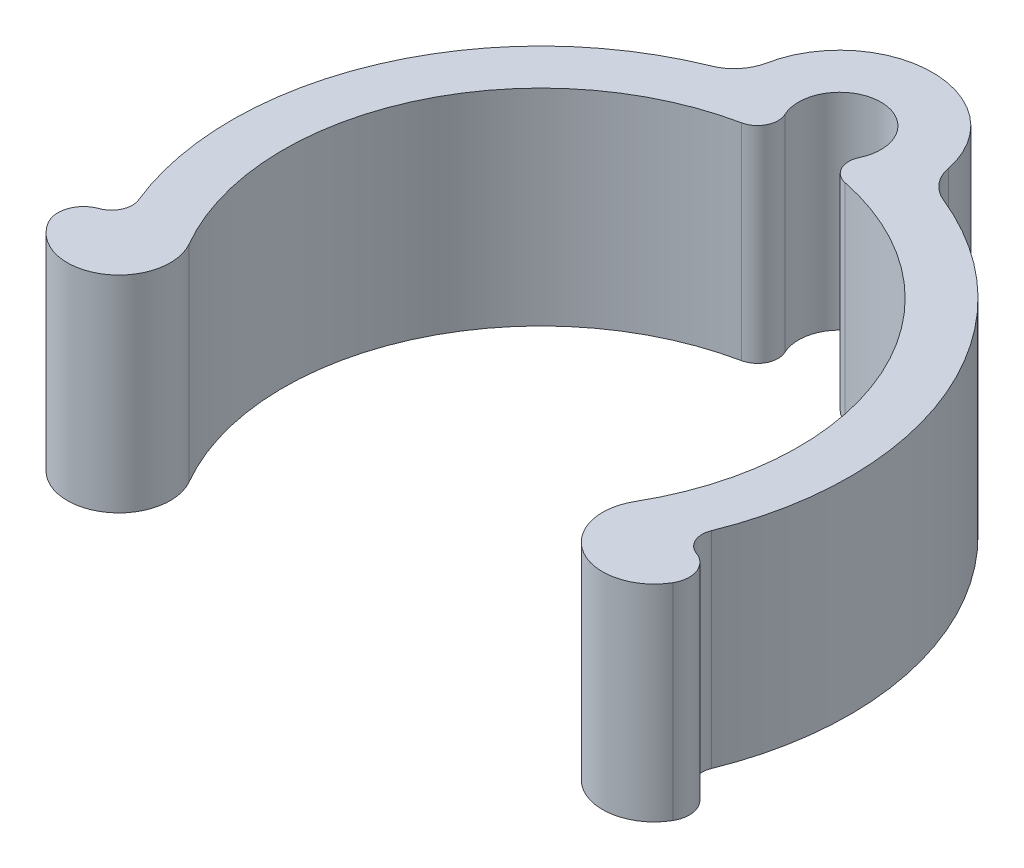
ISO-10303-21;
HEADER;
FILE_DESCRIPTION(('STEP AP214'),'2;1');
FILE_NAME('part.step','',(''),(''),'','','');
FILE_SCHEMA(('AUTOMOTIVE_DESIGN { 1 0 10303 214 1 1 1 1 }'));
ENDSEC;
DATA;
#1=APPLICATION_CONTEXT('core data for automotive mechanical design processes');
#2=APPLICATION_PROTOCOL_DEFINITION('international standard','automotive_design',2000,#1);
#3=PRODUCT_CONTEXT('',#1,'mechanical');
#4=PRODUCT('Part','Part','',(#3));
#5=PRODUCT_RELATED_PRODUCT_CATEGORY('part','',(#4));
#6=PRODUCT_DEFINITION_FORMATION('','',#4);
#7=PRODUCT_DEFINITION_CONTEXT('part definition',#1,'design');
#8=PRODUCT_DEFINITION('design','',#6,#7);
#9=PRODUCT_DEFINITION_SHAPE('','',#8);
#10=(LENGTH_UNIT() NAMED_UNIT(*) SI_UNIT(.MILLI.,.METRE.));
#11=(NAMED_UNIT(*) PLANE_ANGLE_UNIT() SI_UNIT($,.RADIAN.));
#12=(NAMED_UNIT(*) SI_UNIT($,.STERADIAN.) SOLID_ANGLE_UNIT());
#13=UNCERTAINTY_MEASURE_WITH_UNIT(LENGTH_MEASURE(1.E-05),#10,'distance_accuracy_value','');
#14=(GEOMETRIC_REPRESENTATION_CONTEXT(3) GLOBAL_UNCERTAINTY_ASSIGNED_CONTEXT((#13)) GLOBAL_UNIT_ASSIGNED_CONTEXT((#10,
#11,#12)) REPRESENTATION_CONTEXT('',''));
#15=CARTESIAN_POINT('',(0.,0.,0.));
#16=DIRECTION('',(0.,0.,1.));
#17=DIRECTION('',(1.,0.,0.));
#18=AXIS2_PLACEMENT_3D('',#15,#16,#17);
#19=CARTESIAN_POINT('',(12.9903810567666,10.,7.49999999999997));
#20=DIRECTION('',(0.,-1.,0.));
#21=DIRECTION('',(0.,0.,-1.));
#22=AXIS2_PLACEMENT_3D('',#19,#20,#21);
#23=CYLINDRICAL_SURFACE('',#22,2.5);
#24=CARTESIAN_POINT('',(12.9903810567666,0.,7.49999999999997));
#25=DIRECTION('',(0.,1.,0.));
#26=DIRECTION('',(0.,0.,1.));
#27=AXIS2_PLACEMENT_3D('',#24,#25,#26);
#28=CIRCLE('',#27,2.5);
#29=CARTESIAN_POINT('',(10.8253175473055,0.,6.24999999999998));
#30=VERTEX_POINT('',#29);
#31=CARTESIAN_POINT('',(15.1554445662277,0.,8.74999999999997));
#32=VERTEX_POINT('',#31);
#33=EDGE_CURVE('E177',#30,#32,#28,.T.);
#34=ORIENTED_EDGE('',*,*,#33,.T.);
#35=DIRECTION('',(0.,-1.,0.));
#36=VECTOR('',#35,1.);
#37=CARTESIAN_POINT('',(15.1554445662277,10.,8.74999999999997));
#38=LINE('',#37,#36);
#39=CARTESIAN_POINT('',(15.1554445662277,10.,8.74999999999997));
#40=VERTEX_POINT('',#39);
#41=EDGE_CURVE('E11',#40,#32,#38,.T.);
#42=ORIENTED_EDGE('',*,*,#41,.F.);
#43=CARTESIAN_POINT('',(12.9903810567666,10.,7.49999999999997));
#44=DIRECTION('',(0.,1.,0.));
#45=DIRECTION('',(0.,0.,1.));
#46=AXIS2_PLACEMENT_3D('',#43,#44,#45);
#47=CIRCLE('',#46,2.5);
#48=CARTESIAN_POINT('',(10.8253175473055,10.,6.24999999999998));
#49=VERTEX_POINT('',#48);
#50=EDGE_CURVE('E207',#49,#40,#47,.T.);
#51=ORIENTED_EDGE('',*,*,#50,.F.);
#52=DIRECTION('',(0.,-1.,0.));
#53=VECTOR('',#52,1.);
#54=CARTESIAN_POINT('',(10.8253175473055,10.,6.24999999999998));
#55=LINE('',#54,#53);
#56=EDGE_CURVE('E173',#49,#30,#55,.T.);
#57=ORIENTED_EDGE('',*,*,#56,.T.);
#58=EDGE_LOOP('',(#34,#42,#51,#57));
#59=FACE_BOUND('',#58,.T.);
#60=ADVANCED_FACE('F33',(#59),#23,.T.);
#61=CARTESIAN_POINT('',(14.0729128114972,10.,8.12499999999997));
#62=DIRECTION('',(0.,-1.,0.));
#63=DIRECTION('',(0.,0.,-1.));
#64=AXIS2_PLACEMENT_3D('',#61,#62,#63);
#65=CYLINDRICAL_SURFACE('',#64,1.24999999999999);
#66=CARTESIAN_POINT('',(14.0729128114972,0.,8.12499999999997));
#67=DIRECTION('',(0.,1.,0.));
#68=DIRECTION('',(0.,0.,1.));
#69=AXIS2_PLACEMENT_3D('',#66,#67,#68);
#70=CIRCLE('',#69,1.24999999999999);
#71=CARTESIAN_POINT('',(14.4934624354318,0.,6.94786873552331));
#72=VERTEX_POINT('',#71);
#73=EDGE_CURVE('E180',#32,#72,#70,.T.);
#74=ORIENTED_EDGE('',*,*,#73,.T.);
#75=DIRECTION('',(0.,-1.,0.));
#76=VECTOR('',#75,1.);
#77=CARTESIAN_POINT('',(14.4934624354318,10.,6.94786873552331));
#78=LINE('',#77,#76);
#79=CARTESIAN_POINT('',(14.4934624354318,10.,6.94786873552331));
#80=VERTEX_POINT('',#79);
#81=EDGE_CURVE('E41',#80,#72,#78,.T.);
#82=ORIENTED_EDGE('',*,*,#81,.F.);
#83=CARTESIAN_POINT('',(14.0729128114972,10.,8.12499999999997));
#84=DIRECTION('',(0.,1.,0.));
#85=DIRECTION('',(0.,0.,1.));
#86=AXIS2_PLACEMENT_3D('',#83,#84,#85);
#87=CIRCLE('',#86,1.24999999999999);
#88=EDGE_CURVE('E116',#40,#80,#87,.T.);
#89=ORIENTED_EDGE('',*,*,#88,.F.);
#90=ORIENTED_EDGE('',*,*,#41,.T.);
#91=EDGE_LOOP('',(#74,#82,#89,#90));
#92=FACE_BOUND('',#91,.T.);
#93=ADVANCED_FACE('F305',(#92),#65,.T.);
#94=CARTESIAN_POINT('',(14.8299021345794,10.,6.00616372394197));
#95=DIRECTION('',(0.,-1.,0.));
#96=DIRECTION('',(0.,0.,-1.));
#97=AXIS2_PLACEMENT_3D('',#94,#95,#96);
#98=CYLINDRICAL_SURFACE('',#97,1.);
#99=CARTESIAN_POINT('',(14.8299021345794,0.,6.00616372394197));
#100=DIRECTION('',(0.,-1.,0.));
#101=DIRECTION('',(0.,0.,1.));
#102=AXIS2_PLACEMENT_3D('',#99,#100,#101);
#103=CIRCLE('',#102,1.);
#104=CARTESIAN_POINT('',(13.9030332511682,0.,5.63077849119559));
#105=VERTEX_POINT('',#104);
#106=EDGE_CURVE('E182',#72,#105,#103,.T.);
#107=ORIENTED_EDGE('',*,*,#106,.T.);
#108=DIRECTION('',(0.,-1.,0.));
#109=VECTOR('',#108,1.);
#110=CARTESIAN_POINT('',(13.9030332511682,10.,5.63077849119559));
#111=LINE('',#110,#109);
#112=CARTESIAN_POINT('',(13.9030332511682,10.,5.63077849119559));
#113=VERTEX_POINT('',#112);
#114=EDGE_CURVE('E238',#113,#105,#111,.T.);
#115=ORIENTED_EDGE('',*,*,#114,.F.);
#116=CARTESIAN_POINT('',(14.8299021345794,10.,6.00616372394197));
#117=DIRECTION('',(0.,-1.,0.));
#118=DIRECTION('',(0.,0.,1.));
#119=AXIS2_PLACEMENT_3D('',#116,#117,#118);
#120=CIRCLE('',#119,1.);
#121=EDGE_CURVE('E246',#80,#113,#120,.T.);
#122=ORIENTED_EDGE('',*,*,#121,.F.);
#123=ORIENTED_EDGE('',*,*,#81,.T.);
#124=EDGE_LOOP('',(#107,#115,#122,#123));
#125=FACE_BOUND('',#124,.T.);
#126=ADVANCED_FACE('F244',(#125),#98,.F.);
#127=CARTESIAN_POINT('',(0.,10.,0.));
#128=DIRECTION('',(0.,-1.,0.));
#129=DIRECTION('',(0.,0.,-1.));
#130=AXIS2_PLACEMENT_3D('',#127,#128,#129);
#131=CYLINDRICAL_SURFACE('',#130,15.);
#132=CARTESIAN_POINT('',(0.,0.,0.));
#133=DIRECTION('',(0.,1.,0.));
#134=DIRECTION('',(0.,0.,1.));
#135=AXIS2_PLACEMENT_3D('',#132,#133,#134);
#136=CIRCLE('',#135,15.);
#137=CARTESIAN_POINT('',(5.62674706153355,0.,-13.9046653144016));
#138=VERTEX_POINT('',#137);
#139=EDGE_CURVE('E184',#105,#138,#136,.T.);
#140=ORIENTED_EDGE('',*,*,#139,.T.);
#141=DIRECTION('',(0.,-1.,0.));
#142=VECTOR('',#141,1.);
#143=CARTESIAN_POINT('',(5.62674706153355,10.,-13.9046653144016));
#144=LINE('',#143,#142);
#145=CARTESIAN_POINT('',(5.62674706153355,10.,-13.9046653144016));
#146=VERTEX_POINT('',#145);
#147=EDGE_CURVE('E235',#146,#138,#144,.T.);
#148=ORIENTED_EDGE('',*,*,#147,.F.);
#149=CARTESIAN_POINT('',(0.,10.,0.));
#150=DIRECTION('',(0.,1.,0.));
#151=DIRECTION('',(0.,0.,1.));
#152=AXIS2_PLACEMENT_3D('',#149,#150,#151);
#153=CIRCLE('',#152,15.);
#154=EDGE_CURVE('E264',#113,#146,#153,.T.);
#155=ORIENTED_EDGE('',*,*,#154,.F.);
#156=ORIENTED_EDGE('',*,*,#114,.T.);
#157=EDGE_LOOP('',(#140,#148,#155,#156));
#158=FACE_BOUND('',#157,.T.);
#159=ADVANCED_FACE('F255',(#158),#131,.T.);
#160=CARTESIAN_POINT('',(6.37698000307135,10.,-15.7586206896552));
#161=DIRECTION('',(0.,-1.,0.));
#162=DIRECTION('',(0.,0.,-1.));
#163=AXIS2_PLACEMENT_3D('',#160,#161,#162);
#164=CYLINDRICAL_SURFACE('',#163,2.);
#165=CARTESIAN_POINT('',(6.37698000307135,0.,-15.7586206896552));
#166=DIRECTION('',(0.,-1.,0.));
#167=DIRECTION('',(0.,0.,1.));
#168=AXIS2_PLACEMENT_3D('',#165,#166,#167);
#169=CIRCLE('',#168,2.);
#170=CARTESIAN_POINT('',(4.41483230981863,0.,-15.3713527851459));
#171=VERTEX_POINT('',#170);
#172=EDGE_CURVE('E186',#138,#171,#169,.T.);
#173=ORIENTED_EDGE('',*,*,#172,.T.);
#174=DIRECTION('',(0.,-1.,0.));
#175=VECTOR('',#174,1.);
#176=CARTESIAN_POINT('',(4.41483230981863,10.,-15.3713527851459));
#177=LINE('',#176,#175);
#178=CARTESIAN_POINT('',(4.41483230981863,10.,-15.3713527851459));
#179=VERTEX_POINT('',#178);
#180=EDGE_CURVE('E232',#179,#171,#177,.T.);
#181=ORIENTED_EDGE('',*,*,#180,.F.);
#182=CARTESIAN_POINT('',(6.37698000307135,10.,-15.7586206896552));
#183=DIRECTION('',(0.,-1.,0.));
#184=DIRECTION('',(0.,0.,1.));
#185=AXIS2_PLACEMENT_3D('',#182,#183,#184);
#186=CIRCLE('',#185,2.);
#187=EDGE_CURVE('E261',#146,#179,#186,.T.);
#188=ORIENTED_EDGE('',*,*,#187,.F.);
#189=ORIENTED_EDGE('',*,*,#147,.T.);
#190=EDGE_LOOP('',(#173,#181,#188,#189));
#191=FACE_BOUND('',#190,.T.);
#192=ADVANCED_FACE('F259',(#191),#164,.F.);
#193=CARTESIAN_POINT('',(0.,10.,-14.5));
#194=DIRECTION('',(0.,-1.,0.));
#195=DIRECTION('',(0.,0.,-1.));
#196=AXIS2_PLACEMENT_3D('',#193,#194,#195);
#197=CYLINDRICAL_SURFACE('',#196,4.5);
#198=CARTESIAN_POINT('',(0.,0.,-14.5));
#199=DIRECTION('',(0.,1.,0.));
#200=DIRECTION('',(0.,0.,1.));
#201=AXIS2_PLACEMENT_3D('',#198,#199,#200);
#202=CIRCLE('',#201,4.5);
#203=CARTESIAN_POINT('',(-4.41483230981863,0.,-15.3713527851459));
#204=VERTEX_POINT('',#203);
#205=EDGE_CURVE('E188',#171,#204,#202,.T.);
#206=ORIENTED_EDGE('',*,*,#205,.T.);
#207=DIRECTION('',(0.,-1.,0.));
#208=VECTOR('',#207,1.);
#209=CARTESIAN_POINT('',(-4.41483230981863,10.,-15.3713527851459));
#210=LINE('',#209,#208);
#211=CARTESIAN_POINT('',(-4.41483230981863,10.,-15.3713527851459));
#212=VERTEX_POINT('',#211);
#213=EDGE_CURVE('E229',#212,#204,#210,.T.);
#214=ORIENTED_EDGE('',*,*,#213,.F.);
#215=CARTESIAN_POINT('',(0.,10.,-14.5));
#216=DIRECTION('',(0.,1.,0.));
#217=DIRECTION('',(0.,0.,1.));
#218=AXIS2_PLACEMENT_3D('',#215,#216,#217);
#219=CIRCLE('',#218,4.5);
#220=EDGE_CURVE('E263',#179,#212,#219,.T.);
#221=ORIENTED_EDGE('',*,*,#220,.F.);
#222=ORIENTED_EDGE('',*,*,#180,.T.);
#223=EDGE_LOOP('',(#206,#214,#221,#222));
#224=FACE_BOUND('',#223,.T.);
#225=ADVANCED_FACE('F318',(#224),#197,.T.);
#226=CARTESIAN_POINT('',(-6.37698000307135,10.,-15.7586206896552));
#227=DIRECTION('',(0.,-1.,0.));
#228=DIRECTION('',(0.,0.,-1.));
#229=AXIS2_PLACEMENT_3D('',#226,#227,#228);
#230=CYLINDRICAL_SURFACE('',#229,2.);
#231=CARTESIAN_POINT('',(-6.37698000307135,0.,-15.7586206896552));
#232=DIRECTION('',(0.,-1.,0.));
#233=DIRECTION('',(0.,0.,1.));
#234=AXIS2_PLACEMENT_3D('',#231,#232,#233);
#235=CIRCLE('',#234,2.);
#236=CARTESIAN_POINT('',(-5.62674706153354,0.,-13.9046653144016));
#237=VERTEX_POINT('',#236);
#238=EDGE_CURVE('E190',#204,#237,#235,.T.);
#239=ORIENTED_EDGE('',*,*,#238,.T.);
#240=DIRECTION('',(0.,-1.,0.));
#241=VECTOR('',#240,1.);
#242=CARTESIAN_POINT('',(-5.62674706153354,10.,-13.9046653144016));
#243=LINE('',#242,#241);
#244=CARTESIAN_POINT('',(-5.62674706153354,10.,-13.9046653144016));
#245=VERTEX_POINT('',#244);
#246=EDGE_CURVE('E226',#245,#237,#243,.T.);
#247=ORIENTED_EDGE('',*,*,#246,.F.);
#248=CARTESIAN_POINT('',(-6.37698000307135,10.,-15.7586206896552));
#249=DIRECTION('',(0.,-1.,0.));
#250=DIRECTION('',(0.,0.,1.));
#251=AXIS2_PLACEMENT_3D('',#248,#249,#250);
#252=CIRCLE('',#251,2.);
#253=EDGE_CURVE('E266',#212,#245,#252,.T.);
#254=ORIENTED_EDGE('',*,*,#253,.F.);
#255=ORIENTED_EDGE('',*,*,#213,.T.);
#256=EDGE_LOOP('',(#239,#247,#254,#255));
#257=FACE_BOUND('',#256,.T.);
#258=ADVANCED_FACE('F321',(#257),#230,.F.);
#259=CARTESIAN_POINT('',(0.,10.,0.));
#260=DIRECTION('',(0.,-1.,0.));
#261=DIRECTION('',(0.,0.,-1.));
#262=AXIS2_PLACEMENT_3D('',#259,#260,#261);
#263=CYLINDRICAL_SURFACE('',#262,15.);
#264=CARTESIAN_POINT('',(0.,0.,0.));
#265=DIRECTION('',(0.,1.,0.));
#266=DIRECTION('',(0.,0.,1.));
#267=AXIS2_PLACEMENT_3D('',#264,#265,#266);
#268=CIRCLE('',#267,15.);
#269=CARTESIAN_POINT('',(-13.9030332511682,0.,5.63077849119558));
#270=VERTEX_POINT('',#269);
#271=EDGE_CURVE('E192',#237,#270,#268,.T.);
#272=ORIENTED_EDGE('',*,*,#271,.T.);
#273=DIRECTION('',(0.,-1.,0.));
#274=VECTOR('',#273,1.);
#275=CARTESIAN_POINT('',(-13.9030332511682,10.,5.63077849119558));
#276=LINE('',#275,#274);
#277=CARTESIAN_POINT('',(-13.9030332511682,10.,5.63077849119558));
#278=VERTEX_POINT('',#277);
#279=EDGE_CURVE('E223',#278,#270,#276,.T.);
#280=ORIENTED_EDGE('',*,*,#279,.F.);
#281=CARTESIAN_POINT('',(0.,10.,0.));
#282=DIRECTION('',(0.,1.,0.));
#283=DIRECTION('',(0.,0.,1.));
#284=AXIS2_PLACEMENT_3D('',#281,#282,#283);
#285=CIRCLE('',#284,15.);
#286=EDGE_CURVE('E272',#245,#278,#285,.T.);
#287=ORIENTED_EDGE('',*,*,#286,.F.);
#288=ORIENTED_EDGE('',*,*,#246,.T.);
#289=EDGE_LOOP('',(#272,#280,#287,#288));
#290=FACE_BOUND('',#289,.T.);
#291=ADVANCED_FACE('F325',(#290),#263,.T.);
#292=CARTESIAN_POINT('',(-14.8299021345794,10.,6.00616372394195));
#293=DIRECTION('',(0.,-1.,0.));
#294=DIRECTION('',(0.,0.,-1.));
#295=AXIS2_PLACEMENT_3D('',#292,#293,#294);
#296=CYLINDRICAL_SURFACE('',#295,1.);
#297=CARTESIAN_POINT('',(-14.8299021345794,0.,6.00616372394195));
#298=DIRECTION('',(0.,-1.,0.));
#299=DIRECTION('',(0.,0.,-1.));
#300=AXIS2_PLACEMENT_3D('',#297,#298,#299);
#301=CIRCLE('',#300,1.);
#302=CARTESIAN_POINT('',(-14.4934624354318,0.,6.94786873552329));
#303=VERTEX_POINT('',#302);
#304=EDGE_CURVE('E194',#270,#303,#301,.T.);
#305=ORIENTED_EDGE('',*,*,#304,.T.);
#306=DIRECTION('',(0.,-1.,0.));
#307=VECTOR('',#306,1.);
#308=CARTESIAN_POINT('',(-14.4934624354318,10.,6.94786873552329));
#309=LINE('',#308,#307);
#310=CARTESIAN_POINT('',(-14.4934624354318,10.,6.94786873552329));
#311=VERTEX_POINT('',#310);
#312=EDGE_CURVE('E220',#311,#303,#309,.T.);
#313=ORIENTED_EDGE('',*,*,#312,.F.);
#314=CARTESIAN_POINT('',(-14.8299021345794,10.,6.00616372394195));
#315=DIRECTION('',(0.,-1.,0.));
#316=DIRECTION('',(0.,0.,-1.));
#317=AXIS2_PLACEMENT_3D('',#314,#315,#316);
#318=CIRCLE('',#317,1.);
#319=EDGE_CURVE('E274',#278,#311,#318,.T.);
#320=ORIENTED_EDGE('',*,*,#319,.F.);
#321=ORIENTED_EDGE('',*,*,#279,.T.);
#322=EDGE_LOOP('',(#305,#313,#320,#321));
#323=FACE_BOUND('',#322,.T.);
#324=ADVANCED_FACE('F329',(#323),#296,.F.);
#325=CARTESIAN_POINT('',(-14.0729128114972,10.,8.12499999999997));
#326=DIRECTION('',(0.,-1.,0.));
#327=DIRECTION('',(0.,0.,-1.));
#328=AXIS2_PLACEMENT_3D('',#325,#326,#327);
#329=CYLINDRICAL_SURFACE('',#328,1.25);
#330=CARTESIAN_POINT('',(-14.0729128114972,0.,8.12499999999997));
#331=DIRECTION('',(0.,1.,0.));
#332=DIRECTION('',(0.,0.,-1.));
#333=AXIS2_PLACEMENT_3D('',#330,#331,#332);
#334=CIRCLE('',#333,1.25);
#335=CARTESIAN_POINT('',(-15.1554445662277,0.,8.74999999999997));
#336=VERTEX_POINT('',#335);
#337=EDGE_CURVE('E196',#303,#336,#334,.T.);
#338=ORIENTED_EDGE('',*,*,#337,.T.);
#339=DIRECTION('',(0.,-1.,0.));
#340=VECTOR('',#339,1.);
#341=CARTESIAN_POINT('',(-15.1554445662277,10.,8.74999999999997));
#342=LINE('',#341,#340);
#343=CARTESIAN_POINT('',(-15.1554445662277,10.,8.74999999999997));
#344=VERTEX_POINT('',#343);
#345=EDGE_CURVE('E217',#344,#336,#342,.T.);
#346=ORIENTED_EDGE('',*,*,#345,.F.);
#347=CARTESIAN_POINT('',(-14.0729128114972,10.,8.12499999999997));
#348=DIRECTION('',(0.,1.,0.));
#349=DIRECTION('',(0.,0.,-1.));
#350=AXIS2_PLACEMENT_3D('',#347,#348,#349);
#351=CIRCLE('',#350,1.25);
#352=EDGE_CURVE('E276',#311,#344,#351,.T.);
#353=ORIENTED_EDGE('',*,*,#352,.F.);
#354=ORIENTED_EDGE('',*,*,#312,.T.);
#355=EDGE_LOOP('',(#338,#346,#353,#354));
#356=FACE_BOUND('',#355,.T.);
#357=ADVANCED_FACE('F333',(#356),#329,.T.);
#358=CARTESIAN_POINT('',(-12.9903810567666,10.,7.49999999999997));
#359=DIRECTION('',(0.,-1.,0.));
#360=DIRECTION('',(0.,0.,-1.));
#361=AXIS2_PLACEMENT_3D('',#358,#359,#360);
#362=CYLINDRICAL_SURFACE('',#361,2.50000000000001);
#363=CARTESIAN_POINT('',(-12.9903810567666,0.,7.49999999999997));
#364=DIRECTION('',(0.,1.,0.));
#365=DIRECTION('',(0.,0.,-1.));
#366=AXIS2_PLACEMENT_3D('',#363,#364,#365);
#367=CIRCLE('',#366,2.50000000000001);
#368=CARTESIAN_POINT('',(-10.8253175473055,0.,6.24999999999997));
#369=VERTEX_POINT('',#368);
#370=EDGE_CURVE('E198',#336,#369,#367,.T.);
#371=ORIENTED_EDGE('',*,*,#370,.T.);
#372=DIRECTION('',(0.,-1.,0.));
#373=VECTOR('',#372,1.);
#374=CARTESIAN_POINT('',(-10.8253175473055,10.,6.24999999999997));
#375=LINE('',#374,#373);
#376=CARTESIAN_POINT('',(-10.8253175473055,10.,6.24999999999997));
#377=VERTEX_POINT('',#376);
#378=EDGE_CURVE('E214',#377,#369,#375,.T.);
#379=ORIENTED_EDGE('',*,*,#378,.F.);
#380=CARTESIAN_POINT('',(-12.9903810567666,10.,7.49999999999997));
#381=DIRECTION('',(0.,1.,0.));
#382=DIRECTION('',(0.,0.,-1.));
#383=AXIS2_PLACEMENT_3D('',#380,#381,#382);
#384=CIRCLE('',#383,2.50000000000001);
#385=EDGE_CURVE('E278',#344,#377,#384,.T.);
#386=ORIENTED_EDGE('',*,*,#385,.F.);
#387=ORIENTED_EDGE('',*,*,#345,.T.);
#388=EDGE_LOOP('',(#371,#379,#386,#387));
#389=FACE_BOUND('',#388,.T.);
#390=ADVANCED_FACE('F337',(#389),#362,.T.);
#391=CARTESIAN_POINT('',(0.,10.,0.));
#392=DIRECTION('',(0.,-1.,0.));
#393=DIRECTION('',(0.,0.,-1.));
#394=AXIS2_PLACEMENT_3D('',#391,#392,#393);
#395=CYLINDRICAL_SURFACE('',#394,12.5);
#396=CARTESIAN_POINT('',(0.,0.,0.));
#397=DIRECTION('',(0.,-1.,0.));
#398=DIRECTION('',(0.,0.,1.));
#399=AXIS2_PLACEMENT_3D('',#396,#397,#398);
#400=CIRCLE('',#399,12.5);
#401=CARTESIAN_POINT('',(-2.51405104534221,0.,-12.2445721583653));
#402=VERTEX_POINT('',#401);
#403=EDGE_CURVE('E200',#369,#402,#400,.T.);
#404=ORIENTED_EDGE('',*,*,#403,.T.);
#405=DIRECTION('',(0.,-1.,0.));
#406=VECTOR('',#405,1.);
#407=CARTESIAN_POINT('',(-2.51405104534221,10.,-12.2445721583653));
#408=LINE('',#407,#406);
#409=CARTESIAN_POINT('',(-2.51405104534221,10.,-12.2445721583653));
#410=VERTEX_POINT('',#409);
#411=EDGE_CURVE('E211',#410,#402,#408,.T.);
#412=ORIENTED_EDGE('',*,*,#411,.F.);
#413=CARTESIAN_POINT('',(0.,10.,0.));
#414=DIRECTION('',(0.,-1.,0.));
#415=DIRECTION('',(0.,0.,1.));
#416=AXIS2_PLACEMENT_3D('',#413,#414,#415);
#417=CIRCLE('',#416,12.5);
#418=EDGE_CURVE('E280',#377,#410,#417,.T.);
#419=ORIENTED_EDGE('',*,*,#418,.F.);
#420=ORIENTED_EDGE('',*,*,#378,.T.);
#421=EDGE_LOOP('',(#404,#412,#419,#420));
#422=FACE_BOUND('',#421,.T.);
#423=ADVANCED_FACE('F286',(#422),#395,.F.);
#424=CARTESIAN_POINT('',(-2.71517512896959,10.,-13.2241379310345));
#425=DIRECTION('',(0.,-1.,0.));
#426=DIRECTION('',(0.,0.,-1.));
#427=AXIS2_PLACEMENT_3D('',#424,#425,#426);
#428=CYLINDRICAL_SURFACE('',#427,0.999999999999999);
#429=CARTESIAN_POINT('',(-2.71517512896959,0.,-13.2241379310345));
#430=DIRECTION('',(0.,1.,0.));
#431=DIRECTION('',(0.,0.,1.));
#432=AXIS2_PLACEMENT_3D('',#429,#430,#431);
#433=CIRCLE('',#432,0.999999999999999);
#434=CARTESIAN_POINT('',(-1.81011675264639,0.,-13.6494252873563));
#435=VERTEX_POINT('',#434);
#436=EDGE_CURVE('E202',#402,#435,#433,.T.);
#437=ORIENTED_EDGE('',*,*,#436,.T.);
#438=DIRECTION('',(0.,-1.,0.));
#439=VECTOR('',#438,1.);
#440=CARTESIAN_POINT('',(-1.81011675264639,10.,-13.6494252873563));
#441=LINE('',#440,#439);
#442=CARTESIAN_POINT('',(-1.81011675264639,10.,-13.6494252873563));
#443=VERTEX_POINT('',#442);
#444=EDGE_CURVE('E168',#443,#435,#441,.T.);
#445=ORIENTED_EDGE('',*,*,#444,.F.);
#446=CARTESIAN_POINT('',(-2.71517512896959,10.,-13.2241379310345));
#447=DIRECTION('',(0.,1.,0.));
#448=DIRECTION('',(0.,0.,1.));
#449=AXIS2_PLACEMENT_3D('',#446,#447,#448);
#450=CIRCLE('',#449,0.999999999999999);
#451=EDGE_CURVE('E159',#410,#443,#450,.T.);
#452=ORIENTED_EDGE('',*,*,#451,.F.);
#453=ORIENTED_EDGE('',*,*,#411,.T.);
#454=EDGE_LOOP('',(#437,#445,#452,#453));
#455=FACE_BOUND('',#454,.T.);
#456=ADVANCED_FACE('F290',(#455),#428,.T.);
#457=CARTESIAN_POINT('',(0.,10.,-14.5));
#458=DIRECTION('',(0.,-1.,0.));
#459=DIRECTION('',(0.,0.,-1.));
#460=AXIS2_PLACEMENT_3D('',#457,#458,#459);
#461=CYLINDRICAL_SURFACE('',#460,2.);
#462=CARTESIAN_POINT('',(0.,0.,-14.5));
#463=DIRECTION('',(0.,-1.,0.));
#464=DIRECTION('',(0.,0.,1.));
#465=AXIS2_PLACEMENT_3D('',#462,#463,#464);
#466=CIRCLE('',#465,2.);
#467=CARTESIAN_POINT('',(1.81011675264639,0.,-13.6494252873563));
#468=VERTEX_POINT('',#467);
#469=EDGE_CURVE('E167',#435,#468,#466,.T.);
#470=ORIENTED_EDGE('',*,*,#469,.T.);
#471=DIRECTION('',(0.,-1.,0.));
#472=VECTOR('',#471,1.);
#473=CARTESIAN_POINT('',(1.81011675264639,10.,-13.6494252873563));
#474=LINE('',#473,#472);
#475=CARTESIAN_POINT('',(1.81011675264639,10.,-13.6494252873563));
#476=VERTEX_POINT('',#475);
#477=EDGE_CURVE('E164',#476,#468,#474,.T.);
#478=ORIENTED_EDGE('',*,*,#477,.F.);
#479=CARTESIAN_POINT('',(0.,10.,-14.5));
#480=DIRECTION('',(0.,-1.,0.));
#481=DIRECTION('',(0.,0.,1.));
#482=AXIS2_PLACEMENT_3D('',#479,#480,#481);
#483=CIRCLE('',#482,2.);
#484=EDGE_CURVE('E153',#443,#476,#483,.T.);
#485=ORIENTED_EDGE('',*,*,#484,.F.);
#486=ORIENTED_EDGE('',*,*,#444,.T.);
#487=EDGE_LOOP('',(#470,#478,#485,#486));
#488=FACE_BOUND('',#487,.T.);
#489=ADVANCED_FACE('F165',(#488),#461,.F.);
#490=CARTESIAN_POINT('',(2.71517512896959,10.,-13.2241379310345));
#491=DIRECTION('',(0.,-1.,0.));
#492=DIRECTION('',(0.,0.,-1.));
#493=AXIS2_PLACEMENT_3D('',#490,#491,#492);
#494=CYLINDRICAL_SURFACE('',#493,0.999999999999999);
#495=CARTESIAN_POINT('',(2.71517512896959,0.,-13.2241379310345));
#496=DIRECTION('',(0.,1.,0.));
#497=DIRECTION('',(0.,0.,1.));
#498=AXIS2_PLACEMENT_3D('',#495,#496,#497);
#499=CIRCLE('',#498,0.999999999999999);
#500=CARTESIAN_POINT('',(2.51405104534221,0.,-12.2445721583653));
#501=VERTEX_POINT('',#500);
#502=EDGE_CURVE('E102',#468,#501,#499,.T.);
#503=ORIENTED_EDGE('',*,*,#502,.T.);
#504=DIRECTION('',(0.,-1.,0.));
#505=VECTOR('',#504,1.);
#506=CARTESIAN_POINT('',(2.51405104534221,10.,-12.2445721583653));
#507=LINE('',#506,#505);
#508=CARTESIAN_POINT('',(2.51405104534221,10.,-12.2445721583653));
#509=VERTEX_POINT('',#508);
#510=EDGE_CURVE('E169',#509,#501,#507,.T.);
#511=ORIENTED_EDGE('',*,*,#510,.F.);
#512=CARTESIAN_POINT('',(2.71517512896959,10.,-13.2241379310345));
#513=DIRECTION('',(0.,1.,0.));
#514=DIRECTION('',(0.,0.,1.));
#515=AXIS2_PLACEMENT_3D('',#512,#513,#514);
#516=CIRCLE('',#515,0.999999999999999);
#517=EDGE_CURVE('E157',#476,#509,#516,.T.);
#518=ORIENTED_EDGE('',*,*,#517,.F.);
#519=ORIENTED_EDGE('',*,*,#477,.T.);
#520=EDGE_LOOP('',(#503,#511,#518,#519));
#521=FACE_BOUND('',#520,.T.);
#522=ADVANCED_FACE('F171',(#521),#494,.T.);
#523=CARTESIAN_POINT('',(0.,10.,0.));
#524=DIRECTION('',(0.,-1.,0.));
#525=DIRECTION('',(0.,0.,-1.));
#526=AXIS2_PLACEMENT_3D('',#523,#524,#525);
#527=CYLINDRICAL_SURFACE('',#526,12.5);
#528=CARTESIAN_POINT('',(0.,0.,0.));
#529=DIRECTION('',(0.,-1.,0.));
#530=DIRECTION('',(0.,0.,1.));
#531=AXIS2_PLACEMENT_3D('',#528,#529,#530);
#532=CIRCLE('',#531,12.5);
#533=EDGE_CURVE('E108',#501,#30,#532,.T.);
#534=ORIENTED_EDGE('',*,*,#533,.T.);
#535=ORIENTED_EDGE('',*,*,#56,.F.);
#536=CARTESIAN_POINT('',(0.,10.,0.));
#537=DIRECTION('',(0.,-1.,0.));
#538=DIRECTION('',(0.,0.,1.));
#539=AXIS2_PLACEMENT_3D('',#536,#537,#538);
#540=CIRCLE('',#539,12.5);
#541=EDGE_CURVE('E49',#509,#49,#540,.T.);
#542=ORIENTED_EDGE('',*,*,#541,.F.);
#543=ORIENTED_EDGE('',*,*,#510,.T.);
#544=EDGE_LOOP('',(#534,#535,#542,#543));
#545=FACE_BOUND('',#544,.T.);
#546=ADVANCED_FACE('F294',(#545),#527,.F.);
#547=CARTESIAN_POINT('',(13.5316469341319,10.,7.81249999999997));
#548=DIRECTION('',(0.,1.,0.));
#549=DIRECTION('',(0.,0.,1.));
#550=AXIS2_PLACEMENT_3D('',#547,#548,#549);
#551=PLANE('',#550);
#552=ORIENTED_EDGE('',*,*,#50,.T.);
#553=ORIENTED_EDGE('',*,*,#88,.T.);
#554=ORIENTED_EDGE('',*,*,#121,.T.);
#555=ORIENTED_EDGE('',*,*,#154,.T.);
#556=ORIENTED_EDGE('',*,*,#187,.T.);
#557=ORIENTED_EDGE('',*,*,#220,.T.);
#558=ORIENTED_EDGE('',*,*,#253,.T.);
#559=ORIENTED_EDGE('',*,*,#286,.T.);
#560=ORIENTED_EDGE('',*,*,#319,.T.);
#561=ORIENTED_EDGE('',*,*,#352,.T.);
#562=ORIENTED_EDGE('',*,*,#385,.T.);
#563=ORIENTED_EDGE('',*,*,#418,.T.);
#564=ORIENTED_EDGE('',*,*,#451,.T.);
#565=ORIENTED_EDGE('',*,*,#484,.T.);
#566=ORIENTED_EDGE('',*,*,#517,.T.);
#567=ORIENTED_EDGE('',*,*,#541,.T.);
#568=EDGE_LOOP('',(#552,#553,#554,#555,#556,#557,#558,#559,#560,#561,#562,#563,#564,#565,#566,#567));
#569=FACE_BOUND('',#568,.T.);
#570=ADVANCED_FACE('F155',(#569),#551,.T.);
#571=CARTESIAN_POINT('',(13.5316469341319,0.,7.81249999999997));
#572=DIRECTION('',(0.,1.,0.));
#573=DIRECTION('',(0.,0.,1.));
#574=AXIS2_PLACEMENT_3D('',#571,#572,#573);
#575=PLANE('',#574);
#576=ORIENTED_EDGE('',*,*,#33,.F.);
#577=ORIENTED_EDGE('',*,*,#533,.F.);
#578=ORIENTED_EDGE('',*,*,#502,.F.);
#579=ORIENTED_EDGE('',*,*,#469,.F.);
#580=ORIENTED_EDGE('',*,*,#436,.F.);
#581=ORIENTED_EDGE('',*,*,#403,.F.);
#582=ORIENTED_EDGE('',*,*,#370,.F.);
#583=ORIENTED_EDGE('',*,*,#337,.F.);
#584=ORIENTED_EDGE('',*,*,#304,.F.);
#585=ORIENTED_EDGE('',*,*,#271,.F.);
#586=ORIENTED_EDGE('',*,*,#238,.F.);
#587=ORIENTED_EDGE('',*,*,#205,.F.);
#588=ORIENTED_EDGE('',*,*,#172,.F.);
#589=ORIENTED_EDGE('',*,*,#139,.F.);
#590=ORIENTED_EDGE('',*,*,#106,.F.);
#591=ORIENTED_EDGE('',*,*,#73,.F.);
#592=EDGE_LOOP('',(#576,#577,#578,#579,#580,#581,#582,#583,#584,#585,#586,#587,#588,#589,#590,#591));
#593=FACE_BOUND('',#592,.T.);
#594=ADVANCED_FACE('F250',(#593),#575,.F.);
#595=CLOSED_SHELL('',(#60,#93,#126,#159,#192,#225,#258,#291,#324,#357,#390,#423,#456,#489,#522,
#546,#570,#594));
#596=MANIFOLD_SOLID_BREP('B2',#595);
#597=ADVANCED_BREP_SHAPE_REPRESENTATION('',(#18,#596),#14);
#598=SHAPE_DEFINITION_REPRESENTATION(#9,#597);
ENDSEC;
END-ISO-10303-21;
